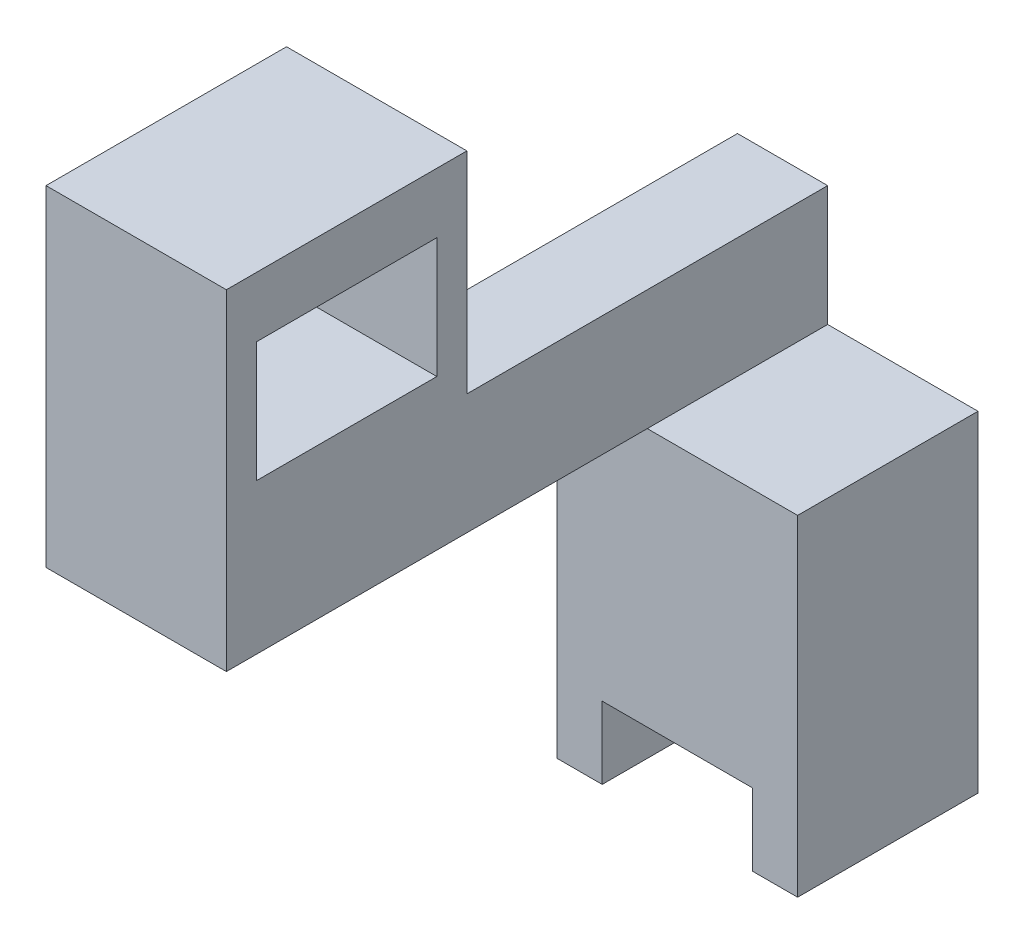
ISO-10303-21;
HEADER;
FILE_DESCRIPTION(('STEP AP214'),'2;1');
FILE_NAME('part.step','',(''),(''),'','','');
FILE_SCHEMA(('AUTOMOTIVE_DESIGN { 1 0 10303 214 1 1 1 1 }'));
ENDSEC;
DATA;
#1=APPLICATION_CONTEXT('core data for automotive mechanical design processes');
#2=APPLICATION_PROTOCOL_DEFINITION('international standard','automotive_design',2000,#1);
#3=PRODUCT_CONTEXT('',#1,'mechanical');
#4=PRODUCT('Part','Part','',(#3));
#5=PRODUCT_RELATED_PRODUCT_CATEGORY('part','',(#4));
#6=PRODUCT_DEFINITION_FORMATION('','',#4);
#7=PRODUCT_DEFINITION_CONTEXT('part definition',#1,'design');
#8=PRODUCT_DEFINITION('design','',#6,#7);
#9=PRODUCT_DEFINITION_SHAPE('','',#8);
#10=(LENGTH_UNIT() NAMED_UNIT(*) SI_UNIT(.MILLI.,.METRE.));
#11=(NAMED_UNIT(*) PLANE_ANGLE_UNIT() SI_UNIT($,.RADIAN.));
#12=(NAMED_UNIT(*) SI_UNIT($,.STERADIAN.) SOLID_ANGLE_UNIT());
#13=UNCERTAINTY_MEASURE_WITH_UNIT(LENGTH_MEASURE(1.E-05),#10,'distance_accuracy_value','');
#14=(GEOMETRIC_REPRESENTATION_CONTEXT(3) GLOBAL_UNCERTAINTY_ASSIGNED_CONTEXT((#13)) GLOBAL_UNIT_ASSIGNED_CONTEXT((#10,
#11,#12)) REPRESENTATION_CONTEXT('',''));
#15=CARTESIAN_POINT('',(0.,0.,0.));
#16=DIRECTION('',(0.,0.,1.));
#17=DIRECTION('',(1.,0.,0.));
#18=AXIS2_PLACEMENT_3D('',#15,#16,#17);
#19=CARTESIAN_POINT('',(0.,-82.5,0.));
#20=DIRECTION('',(0.,1.,0.));
#21=DIRECTION('',(0.,0.,1.));
#22=AXIS2_PLACEMENT_3D('',#19,#20,#21);
#23=PLANE('',#22);
#24=DIRECTION('',(-1.,0.,0.));
#25=VECTOR('',#24,1.);
#26=CARTESIAN_POINT('',(0.,-82.5,-30.));
#27=LINE('',#26,#25);
#28=CARTESIAN_POINT('',(40.,-82.5,-30.));
#29=VERTEX_POINT('',#28);
#30=CARTESIAN_POINT('',(32.5,-82.5,-30.));
#31=VERTEX_POINT('',#30);
#32=EDGE_CURVE('E206',#29,#31,#27,.T.);
#33=ORIENTED_EDGE('',*,*,#32,.T.);
#34=DIRECTION('',(0.,0.,-1.));
#35=VECTOR('',#34,1.);
#36=CARTESIAN_POINT('',(32.5,-82.5,0.));
#37=LINE('',#36,#35);
#38=CARTESIAN_POINT('',(32.5,-82.5,-60.));
#39=VERTEX_POINT('',#38);
#40=EDGE_CURVE('E11',#31,#39,#37,.T.);
#41=ORIENTED_EDGE('',*,*,#40,.T.);
#42=DIRECTION('',(1.,0.,0.));
#43=VECTOR('',#42,1.);
#44=CARTESIAN_POINT('',(0.,-82.5,-60.));
#45=LINE('',#44,#43);
#46=CARTESIAN_POINT('',(40.,-82.5,-60.));
#47=VERTEX_POINT('',#46);
#48=EDGE_CURVE('E198',#39,#47,#45,.T.);
#49=ORIENTED_EDGE('',*,*,#48,.T.);
#50=DIRECTION('',(0.,0.,1.));
#51=VECTOR('',#50,1.);
#52=CARTESIAN_POINT('',(40.,-82.5,-60.));
#53=LINE('',#52,#51);
#54=EDGE_CURVE('E203',#47,#29,#53,.T.);
#55=ORIENTED_EDGE('',*,*,#54,.T.);
#56=EDGE_LOOP('',(#33,#41,#49,#55));
#57=FACE_BOUND('',#56,.T.);
#58=ADVANCED_FACE('F34',(#57),#23,.F.);
#59=CARTESIAN_POINT('',(-15.,-27.5,40.));
#60=DIRECTION('',(0.,1.,0.));
#61=DIRECTION('',(0.,0.,1.));
#62=AXIS2_PLACEMENT_3D('',#59,#60,#61);
#63=PLANE('',#62);
#64=DIRECTION('',(-1.,0.,0.));
#65=VECTOR('',#64,1.);
#66=CARTESIAN_POINT('',(0.,-27.5,-30.));
#67=LINE('',#66,#65);
#68=CARTESIAN_POINT('',(15.,-27.5,-30.));
#69=VERTEX_POINT('',#68);
#70=CARTESIAN_POINT('',(0.,-27.5,-30.));
#71=VERTEX_POINT('',#70);
#72=EDGE_CURVE('E57',#69,#71,#67,.T.);
#73=ORIENTED_EDGE('',*,*,#72,.F.);
#74=DIRECTION('',(0.,0.,-1.));
#75=VECTOR('',#74,1.);
#76=CARTESIAN_POINT('',(15.,-27.5,40.));
#77=LINE('',#76,#75);
#78=CARTESIAN_POINT('',(15.,-27.5,40.));
#79=VERTEX_POINT('',#78);
#80=EDGE_CURVE('E269',#79,#69,#77,.T.);
#81=ORIENTED_EDGE('',*,*,#80,.F.);
#82=DIRECTION('',(1.,0.,0.));
#83=VECTOR('',#82,1.);
#84=CARTESIAN_POINT('',(-15.,-27.5,40.));
#85=LINE('',#84,#83);
#86=CARTESIAN_POINT('',(-15.,-27.5,40.));
#87=VERTEX_POINT('',#86);
#88=EDGE_CURVE('E270',#87,#79,#85,.T.);
#89=ORIENTED_EDGE('',*,*,#88,.F.);
#90=DIRECTION('',(0.,0.,-1.));
#91=VECTOR('',#90,1.);
#92=CARTESIAN_POINT('',(-15.,-27.5,40.));
#93=LINE('',#92,#91);
#94=CARTESIAN_POINT('',(-15.,-27.5,0.));
#95=VERTEX_POINT('',#94);
#96=EDGE_CURVE('E272',#87,#95,#93,.T.);
#97=ORIENTED_EDGE('',*,*,#96,.T.);
#98=DIRECTION('',(1.,0.,0.));
#99=VECTOR('',#98,1.);
#100=CARTESIAN_POINT('',(-15.,-27.5,0.));
#101=LINE('',#100,#99);
#102=CARTESIAN_POINT('',(0.,-27.5,0.));
#103=VERTEX_POINT('',#102);
#104=EDGE_CURVE('E296',#95,#103,#101,.T.);
#105=ORIENTED_EDGE('',*,*,#104,.T.);
#106=DIRECTION('',(0.,0.,1.));
#107=VECTOR('',#106,1.);
#108=CARTESIAN_POINT('',(0.,-27.5,-60.));
#109=LINE('',#108,#107);
#110=EDGE_CURVE('E240',#71,#103,#109,.T.);
#111=ORIENTED_EDGE('',*,*,#110,.F.);
#112=EDGE_LOOP('',(#73,#81,#89,#97,#105,#111));
#113=FACE_BOUND('',#112,.T.);
#114=ADVANCED_FACE('F323',(#113),#63,.F.);
#115=CARTESIAN_POINT('',(15.,-27.5,40.));
#116=DIRECTION('',(-1.,0.,0.));
#117=DIRECTION('',(0.,0.,1.));
#118=AXIS2_PLACEMENT_3D('',#115,#116,#117);
#119=PLANE('',#118);
#120=DIRECTION('',(0.,0.,1.));
#121=VECTOR('',#120,1.);
#122=CARTESIAN_POINT('',(15.,17.5,35.));
#123=LINE('',#122,#121);
#124=CARTESIAN_POINT('',(15.,17.5,5.));
#125=VERTEX_POINT('',#124);
#126=CARTESIAN_POINT('',(15.,17.5,35.));
#127=VERTEX_POINT('',#126);
#128=EDGE_CURVE('E545',#125,#127,#123,.T.);
#129=ORIENTED_EDGE('',*,*,#128,.F.);
#130=DIRECTION('',(0.,1.,0.));
#131=VECTOR('',#130,1.);
#132=CARTESIAN_POINT('',(15.,-2.50000000000001,5.));
#133=LINE('',#132,#131);
#134=CARTESIAN_POINT('',(15.,-2.50000000000001,5.));
#135=VERTEX_POINT('',#134);
#136=EDGE_CURVE('E242',#135,#125,#133,.T.);
#137=ORIENTED_EDGE('',*,*,#136,.F.);
#138=DIRECTION('',(0.,0.,-1.));
#139=VECTOR('',#138,1.);
#140=CARTESIAN_POINT('',(15.,-2.50000000000001,35.));
#141=LINE('',#140,#139);
#142=CARTESIAN_POINT('',(15.,-2.50000000000001,35.));
#143=VERTEX_POINT('',#142);
#144=EDGE_CURVE('E551',#143,#135,#141,.T.);
#145=ORIENTED_EDGE('',*,*,#144,.F.);
#146=DIRECTION('',(0.,-1.,0.));
#147=VECTOR('',#146,1.);
#148=CARTESIAN_POINT('',(15.,-2.50000000000001,35.));
#149=LINE('',#148,#147);
#150=EDGE_CURVE('E548',#127,#143,#149,.T.);
#151=ORIENTED_EDGE('',*,*,#150,.F.);
#152=EDGE_LOOP('',(#129,#137,#145,#151));
#153=FACE_BOUND('',#152,.T.);
#154=ORIENTED_EDGE('',*,*,#80,.T.);
#155=CARTESIAN_POINT('',(15.,-27.5,-60.));
#156=VERTEX_POINT('',#155);
#157=EDGE_CURVE('E265',#69,#156,#77,.T.);
#158=ORIENTED_EDGE('',*,*,#157,.T.);
#159=DIRECTION('',(0.,-1.,0.));
#160=VECTOR('',#159,1.);
#161=CARTESIAN_POINT('',(15.,-27.5,-60.));
#162=LINE('',#161,#160);
#163=CARTESIAN_POINT('',(15.,-7.5,-60.));
#164=VERTEX_POINT('',#163);
#165=EDGE_CURVE('E221',#164,#156,#162,.T.);
#166=ORIENTED_EDGE('',*,*,#165,.F.);
#167=DIRECTION('',(0.,0.,1.));
#168=VECTOR('',#167,1.);
#169=CARTESIAN_POINT('',(15.,-7.5,-60.));
#170=LINE('',#169,#168);
#171=CARTESIAN_POINT('',(15.,-7.5,0.));
#172=VERTEX_POINT('',#171);
#173=EDGE_CURVE('E223',#164,#172,#170,.T.);
#174=ORIENTED_EDGE('',*,*,#173,.T.);
#175=DIRECTION('',(0.,1.,0.));
#176=VECTOR('',#175,1.);
#177=CARTESIAN_POINT('',(15.,-27.5,0.));
#178=LINE('',#177,#176);
#179=CARTESIAN_POINT('',(15.,27.5,0.));
#180=VERTEX_POINT('',#179);
#181=EDGE_CURVE('E291',#172,#180,#178,.T.);
#182=ORIENTED_EDGE('',*,*,#181,.T.);
#183=DIRECTION('',(0.,0.,-1.));
#184=VECTOR('',#183,1.);
#185=CARTESIAN_POINT('',(15.,27.5,40.));
#186=LINE('',#185,#184);
#187=CARTESIAN_POINT('',(15.,27.5,40.));
#188=VERTEX_POINT('',#187);
#189=EDGE_CURVE('E244',#188,#180,#186,.T.);
#190=ORIENTED_EDGE('',*,*,#189,.F.);
#191=DIRECTION('',(0.,1.,0.));
#192=VECTOR('',#191,1.);
#193=CARTESIAN_POINT('',(15.,-27.5,40.));
#194=LINE('',#193,#192);
#195=EDGE_CURVE('E306',#79,#188,#194,.T.);
#196=ORIENTED_EDGE('',*,*,#195,.F.);
#197=EDGE_LOOP('',(#154,#158,#166,#174,#182,#190,#196));
#198=FACE_BOUND('',#197,.T.);
#199=ADVANCED_FACE('F36',(#153,#198),#119,.F.);
#200=CARTESIAN_POINT('',(-15.,27.5,40.));
#201=DIRECTION('',(0.,-1.,0.));
#202=DIRECTION('',(0.,0.,-1.));
#203=AXIS2_PLACEMENT_3D('',#200,#201,#202);
#204=PLANE('',#203);
#205=DIRECTION('',(-1.,0.,0.));
#206=VECTOR('',#205,1.);
#207=CARTESIAN_POINT('',(-15.,27.5,0.));
#208=LINE('',#207,#206);
#209=CARTESIAN_POINT('',(-15.,27.5,0.));
#210=VERTEX_POINT('',#209);
#211=EDGE_CURVE('E294',#180,#210,#208,.T.);
#212=ORIENTED_EDGE('',*,*,#211,.T.);
#213=DIRECTION('',(0.,0.,-1.));
#214=VECTOR('',#213,1.);
#215=CARTESIAN_POINT('',(-15.,27.5,40.));
#216=LINE('',#215,#214);
#217=CARTESIAN_POINT('',(-15.,27.5,40.));
#218=VERTEX_POINT('',#217);
#219=EDGE_CURVE('E286',#218,#210,#216,.T.);
#220=ORIENTED_EDGE('',*,*,#219,.F.);
#221=DIRECTION('',(-1.,0.,0.));
#222=VECTOR('',#221,1.);
#223=CARTESIAN_POINT('',(-15.,27.5,40.));
#224=LINE('',#223,#222);
#225=EDGE_CURVE('E309',#188,#218,#224,.T.);
#226=ORIENTED_EDGE('',*,*,#225,.F.);
#227=ORIENTED_EDGE('',*,*,#189,.T.);
#228=EDGE_LOOP('',(#212,#220,#226,#227));
#229=FACE_BOUND('',#228,.T.);
#230=ADVANCED_FACE('F326',(#229),#204,.F.);
#231=CARTESIAN_POINT('',(-15.,-27.5,40.));
#232=DIRECTION('',(1.,0.,0.));
#233=DIRECTION('',(0.,0.,-1.));
#234=AXIS2_PLACEMENT_3D('',#231,#232,#233);
#235=PLANE('',#234);
#236=DIRECTION('',(0.,0.,-1.));
#237=VECTOR('',#236,1.);
#238=CARTESIAN_POINT('',(-15.,-2.50000000000001,35.));
#239=LINE('',#238,#237);
#240=CARTESIAN_POINT('',(-15.,-2.50000000000001,35.));
#241=VERTEX_POINT('',#240);
#242=CARTESIAN_POINT('',(-15.,-2.50000000000001,5.));
#243=VERTEX_POINT('',#242);
#244=EDGE_CURVE('E532',#241,#243,#239,.T.);
#245=ORIENTED_EDGE('',*,*,#244,.T.);
#246=DIRECTION('',(0.,1.,0.));
#247=VECTOR('',#246,1.);
#248=CARTESIAN_POINT('',(-15.,-2.50000000000001,5.));
#249=LINE('',#248,#247);
#250=CARTESIAN_POINT('',(-15.,17.5,5.));
#251=VERTEX_POINT('',#250);
#252=EDGE_CURVE('E535',#243,#251,#249,.T.);
#253=ORIENTED_EDGE('',*,*,#252,.T.);
#254=DIRECTION('',(0.,0.,1.));
#255=VECTOR('',#254,1.);
#256=CARTESIAN_POINT('',(-15.,17.5,35.));
#257=LINE('',#256,#255);
#258=CARTESIAN_POINT('',(-15.,17.5,35.));
#259=VERTEX_POINT('',#258);
#260=EDGE_CURVE('E540',#251,#259,#257,.T.);
#261=ORIENTED_EDGE('',*,*,#260,.T.);
#262=DIRECTION('',(0.,-1.,0.));
#263=VECTOR('',#262,1.);
#264=CARTESIAN_POINT('',(-15.,-2.50000000000001,35.));
#265=LINE('',#264,#263);
#266=EDGE_CURVE('E536',#259,#241,#265,.T.);
#267=ORIENTED_EDGE('',*,*,#266,.T.);
#268=EDGE_LOOP('',(#245,#253,#261,#267));
#269=FACE_BOUND('',#268,.T.);
#270=DIRECTION('',(0.,-1.,0.));
#271=VECTOR('',#270,1.);
#272=CARTESIAN_POINT('',(-15.,-27.5,0.));
#273=LINE('',#272,#271);
#274=EDGE_CURVE('E301',#210,#95,#273,.T.);
#275=ORIENTED_EDGE('',*,*,#274,.T.);
#276=ORIENTED_EDGE('',*,*,#96,.F.);
#277=DIRECTION('',(0.,-1.,0.));
#278=VECTOR('',#277,1.);
#279=CARTESIAN_POINT('',(-15.,-27.5,40.));
#280=LINE('',#279,#278);
#281=EDGE_CURVE('E274',#218,#87,#280,.T.);
#282=ORIENTED_EDGE('',*,*,#281,.F.);
#283=ORIENTED_EDGE('',*,*,#219,.T.);
#284=EDGE_LOOP('',(#275,#276,#282,#283));
#285=FACE_BOUND('',#284,.T.);
#286=ADVANCED_FACE('F322',(#269,#285),#235,.F.);
#287=CARTESIAN_POINT('',(0.,0.,40.));
#288=DIRECTION('',(0.,0.,-1.));
#289=DIRECTION('',(-1.,0.,0.));
#290=AXIS2_PLACEMENT_3D('',#287,#288,#289);
#291=PLANE('',#290);
#292=ORIENTED_EDGE('',*,*,#195,.T.);
#293=ORIENTED_EDGE('',*,*,#225,.T.);
#294=ORIENTED_EDGE('',*,*,#281,.T.);
#295=ORIENTED_EDGE('',*,*,#88,.T.);
#296=EDGE_LOOP('',(#292,#293,#294,#295));
#297=FACE_BOUND('',#296,.T.);
#298=ADVANCED_FACE('F319',(#297),#291,.F.);
#299=CARTESIAN_POINT('',(0.,0.,0.));
#300=DIRECTION('',(0.,0.,-1.));
#301=DIRECTION('',(-1.,0.,0.));
#302=AXIS2_PLACEMENT_3D('',#299,#300,#301);
#303=PLANE('',#302);
#304=DIRECTION('',(1.,0.,0.));
#305=VECTOR('',#304,1.);
#306=CARTESIAN_POINT('',(15.,-7.5,0.));
#307=LINE('',#306,#305);
#308=CARTESIAN_POINT('',(0.,-7.5,0.));
#309=VERTEX_POINT('',#308);
#310=EDGE_CURVE('E229',#309,#172,#307,.T.);
#311=ORIENTED_EDGE('',*,*,#310,.F.);
#312=DIRECTION('',(0.,1.,0.));
#313=VECTOR('',#312,1.);
#314=CARTESIAN_POINT('',(0.,-27.5,0.));
#315=LINE('',#314,#313);
#316=EDGE_CURVE('E233',#103,#309,#315,.T.);
#317=ORIENTED_EDGE('',*,*,#316,.F.);
#318=ORIENTED_EDGE('',*,*,#104,.F.);
#319=ORIENTED_EDGE('',*,*,#274,.F.);
#320=ORIENTED_EDGE('',*,*,#211,.F.);
#321=ORIENTED_EDGE('',*,*,#181,.F.);
#322=EDGE_LOOP('',(#311,#317,#318,#319,#320,#321));
#323=FACE_BOUND('',#322,.T.);
#324=ADVANCED_FACE('F328',(#323),#303,.T.);
#325=CARTESIAN_POINT('',(-15.,-2.50000000000001,5.));
#326=DIRECTION('',(0.,0.,-1.));
#327=DIRECTION('',(-1.,0.,0.));
#328=AXIS2_PLACEMENT_3D('',#325,#326,#327);
#329=PLANE('',#328);
#330=ORIENTED_EDGE('',*,*,#136,.T.);
#331=DIRECTION('',(1.,0.,0.));
#332=VECTOR('',#331,1.);
#333=CARTESIAN_POINT('',(-15.,17.5,5.));
#334=LINE('',#333,#332);
#335=EDGE_CURVE('E316',#251,#125,#334,.T.);
#336=ORIENTED_EDGE('',*,*,#335,.F.);
#337=ORIENTED_EDGE('',*,*,#252,.F.);
#338=DIRECTION('',(1.,0.,0.));
#339=VECTOR('',#338,1.);
#340=CARTESIAN_POINT('',(-15.,-2.50000000000001,5.));
#341=LINE('',#340,#339);
#342=EDGE_CURVE('E295',#243,#135,#341,.T.);
#343=ORIENTED_EDGE('',*,*,#342,.T.);
#344=EDGE_LOOP('',(#330,#336,#337,#343));
#345=FACE_BOUND('',#344,.T.);
#346=ADVANCED_FACE('F463',(#345),#329,.F.);
#347=CARTESIAN_POINT('',(-15.,-2.50000000000001,35.));
#348=DIRECTION('',(0.,-1.,0.));
#349=DIRECTION('',(0.,0.,-1.));
#350=AXIS2_PLACEMENT_3D('',#347,#348,#349);
#351=PLANE('',#350);
#352=ORIENTED_EDGE('',*,*,#144,.T.);
#353=ORIENTED_EDGE('',*,*,#342,.F.);
#354=ORIENTED_EDGE('',*,*,#244,.F.);
#355=DIRECTION('',(1.,0.,0.));
#356=VECTOR('',#355,1.);
#357=CARTESIAN_POINT('',(-15.,-2.50000000000001,35.));
#358=LINE('',#357,#356);
#359=EDGE_CURVE('E555',#241,#143,#358,.T.);
#360=ORIENTED_EDGE('',*,*,#359,.T.);
#361=EDGE_LOOP('',(#352,#353,#354,#360));
#362=FACE_BOUND('',#361,.T.);
#363=ADVANCED_FACE('F484',(#362),#351,.F.);
#364=CARTESIAN_POINT('',(-15.,-2.50000000000001,35.));
#365=DIRECTION('',(0.,0.,1.));
#366=DIRECTION('',(1.,0.,0.));
#367=AXIS2_PLACEMENT_3D('',#364,#365,#366);
#368=PLANE('',#367);
#369=ORIENTED_EDGE('',*,*,#150,.T.);
#370=ORIENTED_EDGE('',*,*,#359,.F.);
#371=ORIENTED_EDGE('',*,*,#266,.F.);
#372=DIRECTION('',(1.,0.,0.));
#373=VECTOR('',#372,1.);
#374=CARTESIAN_POINT('',(-15.,17.5,35.));
#375=LINE('',#374,#373);
#376=EDGE_CURVE('E539',#259,#127,#375,.T.);
#377=ORIENTED_EDGE('',*,*,#376,.T.);
#378=EDGE_LOOP('',(#369,#370,#371,#377));
#379=FACE_BOUND('',#378,.T.);
#380=ADVANCED_FACE('F474',(#379),#368,.F.);
#381=CARTESIAN_POINT('',(-15.,17.5,35.));
#382=DIRECTION('',(0.,1.,0.));
#383=DIRECTION('',(0.,0.,1.));
#384=AXIS2_PLACEMENT_3D('',#381,#382,#383);
#385=PLANE('',#384);
#386=ORIENTED_EDGE('',*,*,#128,.T.);
#387=ORIENTED_EDGE('',*,*,#376,.F.);
#388=ORIENTED_EDGE('',*,*,#260,.F.);
#389=ORIENTED_EDGE('',*,*,#335,.T.);
#390=EDGE_LOOP('',(#386,#387,#388,#389));
#391=FACE_BOUND('',#390,.T.);
#392=ADVANCED_FACE('F427',(#391),#385,.F.);
#393=CARTESIAN_POINT('',(0.,-27.5,-60.));
#394=DIRECTION('',(1.,0.,0.));
#395=DIRECTION('',(0.,0.,-1.));
#396=AXIS2_PLACEMENT_3D('',#393,#394,#395);
#397=PLANE('',#396);
#398=ORIENTED_EDGE('',*,*,#316,.T.);
#399=DIRECTION('',(0.,0.,1.));
#400=VECTOR('',#399,1.);
#401=CARTESIAN_POINT('',(0.,-7.5,-60.));
#402=LINE('',#401,#400);
#403=CARTESIAN_POINT('',(0.,-7.5,-60.));
#404=VERTEX_POINT('',#403);
#405=EDGE_CURVE('E226',#404,#309,#402,.T.);
#406=ORIENTED_EDGE('',*,*,#405,.F.);
#407=DIRECTION('',(0.,1.,0.));
#408=VECTOR('',#407,1.);
#409=CARTESIAN_POINT('',(0.,-27.5,-60.));
#410=LINE('',#409,#408);
#411=CARTESIAN_POINT('',(0.,-82.5,-60.));
#412=VERTEX_POINT('',#411);
#413=EDGE_CURVE('E218',#412,#404,#410,.T.);
#414=ORIENTED_EDGE('',*,*,#413,.F.);
#415=DIRECTION('',(0.,0.,-1.));
#416=VECTOR('',#415,1.);
#417=CARTESIAN_POINT('',(0.,-82.5,-60.));
#418=LINE('',#417,#416);
#419=CARTESIAN_POINT('',(0.,-82.5,-30.));
#420=VERTEX_POINT('',#419);
#421=EDGE_CURVE('E195',#420,#412,#418,.T.);
#422=ORIENTED_EDGE('',*,*,#421,.F.);
#423=DIRECTION('',(0.,1.,0.));
#424=VECTOR('',#423,1.);
#425=CARTESIAN_POINT('',(0.,-82.5,-30.));
#426=LINE('',#425,#424);
#427=EDGE_CURVE('E208',#420,#71,#426,.T.);
#428=ORIENTED_EDGE('',*,*,#427,.T.);
#429=ORIENTED_EDGE('',*,*,#110,.T.);
#430=EDGE_LOOP('',(#398,#406,#414,#422,#428,#429));
#431=FACE_BOUND('',#430,.T.);
#432=ADVANCED_FACE('F258',(#431),#397,.F.);
#433=CARTESIAN_POINT('',(15.,-7.5,-60.));
#434=DIRECTION('',(0.,-1.,0.));
#435=DIRECTION('',(0.,0.,-1.));
#436=AXIS2_PLACEMENT_3D('',#433,#434,#435);
#437=PLANE('',#436);
#438=ORIENTED_EDGE('',*,*,#310,.T.);
#439=ORIENTED_EDGE('',*,*,#173,.F.);
#440=DIRECTION('',(1.,0.,0.));
#441=VECTOR('',#440,1.);
#442=CARTESIAN_POINT('',(15.,-7.5,-60.));
#443=LINE('',#442,#441);
#444=EDGE_CURVE('E220',#404,#164,#443,.T.);
#445=ORIENTED_EDGE('',*,*,#444,.F.);
#446=ORIENTED_EDGE('',*,*,#405,.T.);
#447=EDGE_LOOP('',(#438,#439,#445,#446));
#448=FACE_BOUND('',#447,.T.);
#449=ADVANCED_FACE('F334',(#448),#437,.F.);
#450=CARTESIAN_POINT('',(0.,0.,-60.));
#451=DIRECTION('',(0.,0.,1.));
#452=DIRECTION('',(1.,0.,0.));
#453=AXIS2_PLACEMENT_3D('',#450,#451,#452);
#454=PLANE('',#453);
#455=ORIENTED_EDGE('',*,*,#48,.F.);
#456=DIRECTION('',(0.,1.,0.));
#457=VECTOR('',#456,1.);
#458=CARTESIAN_POINT('',(32.5,0.,-60.));
#459=LINE('',#458,#457);
#460=CARTESIAN_POINT('',(32.5,-70.5,-60.));
#461=VERTEX_POINT('',#460);
#462=EDGE_CURVE('E191',#39,#461,#459,.T.);
#463=ORIENTED_EDGE('',*,*,#462,.T.);
#464=DIRECTION('',(-1.,0.,0.));
#465=VECTOR('',#464,1.);
#466=CARTESIAN_POINT('',(0.,-70.5,-60.));
#467=LINE('',#466,#465);
#468=CARTESIAN_POINT('',(7.5,-70.5,-60.));
#469=VERTEX_POINT('',#468);
#470=EDGE_CURVE('E170',#461,#469,#467,.T.);
#471=ORIENTED_EDGE('',*,*,#470,.T.);
#472=DIRECTION('',(0.,-1.,0.));
#473=VECTOR('',#472,1.);
#474=CARTESIAN_POINT('',(7.50000000000004,0.,-60.));
#475=LINE('',#474,#473);
#476=CARTESIAN_POINT('',(7.49999999999999,-82.5,-60.));
#477=VERTEX_POINT('',#476);
#478=EDGE_CURVE('E187',#469,#477,#475,.T.);
#479=ORIENTED_EDGE('',*,*,#478,.T.);
#480=EDGE_CURVE('E200',#412,#477,#45,.T.);
#481=ORIENTED_EDGE('',*,*,#480,.F.);
#482=ORIENTED_EDGE('',*,*,#413,.T.);
#483=ORIENTED_EDGE('',*,*,#444,.T.);
#484=ORIENTED_EDGE('',*,*,#165,.T.);
#485=DIRECTION('',(1.,0.,0.));
#486=VECTOR('',#485,1.);
#487=CARTESIAN_POINT('',(0.,-27.5,-60.));
#488=LINE('',#487,#486);
#489=CARTESIAN_POINT('',(40.,-27.5,-60.));
#490=VERTEX_POINT('',#489);
#491=EDGE_CURVE('E194',#156,#490,#488,.T.);
#492=ORIENTED_EDGE('',*,*,#491,.T.);
#493=DIRECTION('',(0.,1.,0.));
#494=VECTOR('',#493,1.);
#495=CARTESIAN_POINT('',(40.,-82.5,-60.));
#496=LINE('',#495,#494);
#497=EDGE_CURVE('E216',#47,#490,#496,.T.);
#498=ORIENTED_EDGE('',*,*,#497,.F.);
#499=EDGE_LOOP('',(#455,#463,#471,#479,#481,#482,#483,#484,#492,#498));
#500=FACE_BOUND('',#499,.T.);
#501=ADVANCED_FACE('F338',(#500),#454,.F.);
#502=CARTESIAN_POINT('',(0.,-27.5,0.));
#503=DIRECTION('',(0.,1.,0.));
#504=DIRECTION('',(0.,0.,1.));
#505=AXIS2_PLACEMENT_3D('',#502,#503,#504);
#506=PLANE('',#505);
#507=ORIENTED_EDGE('',*,*,#157,.F.);
#508=CARTESIAN_POINT('',(40.,-27.5,-30.));
#509=VERTEX_POINT('',#508);
#510=EDGE_CURVE('E199',#509,#69,#67,.T.);
#511=ORIENTED_EDGE('',*,*,#510,.F.);
#512=DIRECTION('',(0.,0.,1.));
#513=VECTOR('',#512,1.);
#514=CARTESIAN_POINT('',(40.,-27.5,-60.));
#515=LINE('',#514,#513);
#516=EDGE_CURVE('E211',#490,#509,#515,.T.);
#517=ORIENTED_EDGE('',*,*,#516,.F.);
#518=ORIENTED_EDGE('',*,*,#491,.F.);
#519=EDGE_LOOP('',(#507,#511,#517,#518));
#520=FACE_BOUND('',#519,.T.);
#521=ADVANCED_FACE('F263',(#520),#506,.T.);
#522=CARTESIAN_POINT('',(40.,-82.5,-60.));
#523=DIRECTION('',(-1.,0.,0.));
#524=DIRECTION('',(0.,0.,1.));
#525=AXIS2_PLACEMENT_3D('',#522,#523,#524);
#526=PLANE('',#525);
#527=ORIENTED_EDGE('',*,*,#516,.T.);
#528=DIRECTION('',(0.,1.,0.));
#529=VECTOR('',#528,1.);
#530=CARTESIAN_POINT('',(40.,-82.5,-30.));
#531=LINE('',#530,#529);
#532=EDGE_CURVE('E248',#29,#509,#531,.T.);
#533=ORIENTED_EDGE('',*,*,#532,.F.);
#534=ORIENTED_EDGE('',*,*,#54,.F.);
#535=ORIENTED_EDGE('',*,*,#497,.T.);
#536=EDGE_LOOP('',(#527,#533,#534,#535));
#537=FACE_BOUND('',#536,.T.);
#538=ADVANCED_FACE('F348',(#537),#526,.F.);
#539=CARTESIAN_POINT('',(0.,-82.5,-30.));
#540=DIRECTION('',(0.,0.,-1.));
#541=DIRECTION('',(-1.,0.,0.));
#542=AXIS2_PLACEMENT_3D('',#539,#540,#541);
#543=PLANE('',#542);
#544=DIRECTION('',(-1.,0.,0.));
#545=VECTOR('',#544,1.);
#546=CARTESIAN_POINT('',(7.5,-70.5,-30.));
#547=LINE('',#546,#545);
#548=CARTESIAN_POINT('',(32.5,-70.5,-30.));
#549=VERTEX_POINT('',#548);
#550=CARTESIAN_POINT('',(7.5,-70.5,-30.));
#551=VERTEX_POINT('',#550);
#552=EDGE_CURVE('E168',#549,#551,#547,.T.);
#553=ORIENTED_EDGE('',*,*,#552,.F.);
#554=DIRECTION('',(0.,1.,0.));
#555=VECTOR('',#554,1.);
#556=CARTESIAN_POINT('',(32.5,-70.5,-30.));
#557=LINE('',#556,#555);
#558=EDGE_CURVE('E176',#31,#549,#557,.T.);
#559=ORIENTED_EDGE('',*,*,#558,.F.);
#560=ORIENTED_EDGE('',*,*,#32,.F.);
#561=ORIENTED_EDGE('',*,*,#532,.T.);
#562=ORIENTED_EDGE('',*,*,#510,.T.);
#563=ORIENTED_EDGE('',*,*,#72,.T.);
#564=ORIENTED_EDGE('',*,*,#427,.F.);
#565=CARTESIAN_POINT('',(7.49999999999999,-82.5,-30.));
#566=VERTEX_POINT('',#565);
#567=EDGE_CURVE('E205',#566,#420,#27,.T.);
#568=ORIENTED_EDGE('',*,*,#567,.F.);
#569=DIRECTION('',(0.,-1.,0.));
#570=VECTOR('',#569,1.);
#571=CARTESIAN_POINT('',(7.5,-70.5,-30.));
#572=LINE('',#571,#570);
#573=EDGE_CURVE('E49',#551,#566,#572,.T.);
#574=ORIENTED_EDGE('',*,*,#573,.F.);
#575=EDGE_LOOP('',(#553,#559,#560,#561,#562,#563,#564,#568,#574));
#576=FACE_BOUND('',#575,.T.);
#577=ADVANCED_FACE('F182',(#576),#543,.F.);
#578=ORIENTED_EDGE('',*,*,#480,.T.);
#579=DIRECTION('',(0.,0.,1.));
#580=VECTOR('',#579,1.);
#581=CARTESIAN_POINT('',(7.49999999999999,-82.5,0.));
#582=LINE('',#581,#580);
#583=EDGE_CURVE('E42',#477,#566,#582,.T.);
#584=ORIENTED_EDGE('',*,*,#583,.T.);
#585=ORIENTED_EDGE('',*,*,#567,.T.);
#586=ORIENTED_EDGE('',*,*,#421,.T.);
#587=EDGE_LOOP('',(#578,#584,#585,#586));
#588=FACE_BOUND('',#587,.T.);
#589=ADVANCED_FACE('F341',(#588),#23,.F.);
#590=CARTESIAN_POINT('',(7.5,-70.5,-60.00005));
#591=DIRECTION('',(0.,1.,0.));
#592=DIRECTION('',(0.,0.,1.));
#593=AXIS2_PLACEMENT_3D('',#590,#591,#592);
#594=PLANE('',#593);
#595=DIRECTION('',(0.,0.,1.));
#596=VECTOR('',#595,1.);
#597=CARTESIAN_POINT('',(32.5,-70.5,-60.00005));
#598=LINE('',#597,#596);
#599=EDGE_CURVE('E163',#461,#549,#598,.T.);
#600=ORIENTED_EDGE('',*,*,#599,.T.);
#601=ORIENTED_EDGE('',*,*,#552,.T.);
#602=DIRECTION('',(0.,0.,1.));
#603=VECTOR('',#602,1.);
#604=CARTESIAN_POINT('',(7.5,-70.5,-60.00005));
#605=LINE('',#604,#603);
#606=EDGE_CURVE('E173',#469,#551,#605,.T.);
#607=ORIENTED_EDGE('',*,*,#606,.F.);
#608=ORIENTED_EDGE('',*,*,#470,.F.);
#609=EDGE_LOOP('',(#600,#601,#607,#608));
#610=FACE_BOUND('',#609,.T.);
#611=ADVANCED_FACE('F165',(#610),#594,.F.);
#612=CARTESIAN_POINT('',(32.5,-70.5,-60.00005));
#613=DIRECTION('',(1.,0.,0.));
#614=DIRECTION('',(0.,1.,0.));
#615=AXIS2_PLACEMENT_3D('',#612,#613,#614);
#616=PLANE('',#615);
#617=ORIENTED_EDGE('',*,*,#40,.F.);
#618=ORIENTED_EDGE('',*,*,#558,.T.);
#619=ORIENTED_EDGE('',*,*,#599,.F.);
#620=ORIENTED_EDGE('',*,*,#462,.F.);
#621=EDGE_LOOP('',(#617,#618,#619,#620));
#622=FACE_BOUND('',#621,.T.);
#623=ADVANCED_FACE('F177',(#622),#616,.F.);
#624=CARTESIAN_POINT('',(7.5,-70.5,-60.00005));
#625=DIRECTION('',(-1.,0.,0.));
#626=DIRECTION('',(0.,-1.,0.));
#627=AXIS2_PLACEMENT_3D('',#624,#625,#626);
#628=PLANE('',#627);
#629=ORIENTED_EDGE('',*,*,#606,.T.);
#630=ORIENTED_EDGE('',*,*,#573,.T.);
#631=ORIENTED_EDGE('',*,*,#583,.F.);
#632=ORIENTED_EDGE('',*,*,#478,.F.);
#633=EDGE_LOOP('',(#629,#630,#631,#632));
#634=FACE_BOUND('',#633,.T.);
#635=ADVANCED_FACE('F343',(#634),#628,.F.);
#636=CLOSED_SHELL('',(#58,#114,#199,#230,#286,#298,#324,#346,#363,#380,#392,#432,#449,#501,#521,
#538,#577,#589,#611,#623,#635));
#637=MANIFOLD_SOLID_BREP('B2',#636);
#638=ADVANCED_BREP_SHAPE_REPRESENTATION('',(#18,#637),#14);
#639=SHAPE_DEFINITION_REPRESENTATION(#9,#638);
ENDSEC;
END-ISO-10303-21;
